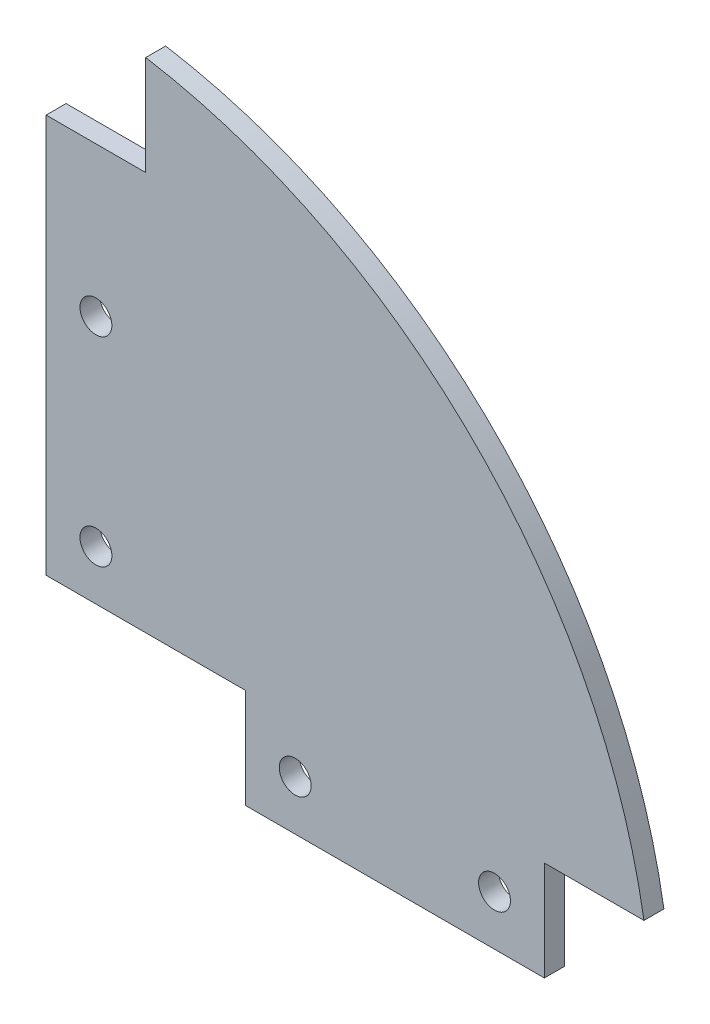
ISO-10303-21;
HEADER;
FILE_DESCRIPTION(('STEP AP214'),'2;1');
FILE_NAME('part.step','',(''),(''),'','','');
FILE_SCHEMA(('AUTOMOTIVE_DESIGN { 1 0 10303 214 1 1 1 1 }'));
ENDSEC;
DATA;
#1=APPLICATION_CONTEXT('core data for automotive mechanical design processes');
#2=APPLICATION_PROTOCOL_DEFINITION('international standard','automotive_design',2000,#1);
#3=PRODUCT_CONTEXT('',#1,'mechanical');
#4=PRODUCT('Part','Part','',(#3));
#5=PRODUCT_RELATED_PRODUCT_CATEGORY('part','',(#4));
#6=PRODUCT_DEFINITION_FORMATION('','',#4);
#7=PRODUCT_DEFINITION_CONTEXT('part definition',#1,'design');
#8=PRODUCT_DEFINITION('design','',#6,#7);
#9=PRODUCT_DEFINITION_SHAPE('','',#8);
#10=(LENGTH_UNIT() NAMED_UNIT(*) SI_UNIT(.MILLI.,.METRE.));
#11=(NAMED_UNIT(*) PLANE_ANGLE_UNIT() SI_UNIT($,.RADIAN.));
#12=(NAMED_UNIT(*) SI_UNIT($,.STERADIAN.) SOLID_ANGLE_UNIT());
#13=UNCERTAINTY_MEASURE_WITH_UNIT(LENGTH_MEASURE(1.E-05),#10,'distance_accuracy_value','');
#14=(GEOMETRIC_REPRESENTATION_CONTEXT(3) GLOBAL_UNCERTAINTY_ASSIGNED_CONTEXT((#13)) GLOBAL_UNIT_ASSIGNED_CONTEXT((#10,
#11,#12)) REPRESENTATION_CONTEXT('',''));
#15=CARTESIAN_POINT('',(0.,0.,0.));
#16=DIRECTION('',(0.,0.,1.));
#17=DIRECTION('',(1.,0.,0.));
#18=AXIS2_PLACEMENT_3D('',#15,#16,#17);
#19=CARTESIAN_POINT('',(0.,0.,2.));
#20=DIRECTION('',(0.,0.,1.));
#21=DIRECTION('',(1.,0.,0.));
#22=AXIS2_PLACEMENT_3D('',#19,#20,#21);
#23=PLANE('',#22);
#24=CARTESIAN_POINT('',(25.,4.99999999999995,2.));
#25=DIRECTION('',(0.,0.,1.));
#26=DIRECTION('',(1.,0.,0.));
#27=AXIS2_PLACEMENT_3D('',#24,#25,#26);
#28=CIRCLE('',#27,1.6);
#29=CARTESIAN_POINT('',(26.6,4.99999999999995,2.));
#30=VERTEX_POINT('',#29);
#31=EDGE_CURVE('E204',#30,#30,#28,.T.);
#32=ORIENTED_EDGE('',*,*,#31,.F.);
#33=EDGE_LOOP('',(#32));
#34=FACE_BOUND('',#33,.T.);
#35=CARTESIAN_POINT('',(5.00000000000001,34.9999999999999,2.));
#36=DIRECTION('',(0.,0.,1.));
#37=DIRECTION('',(1.,0.,0.));
#38=AXIS2_PLACEMENT_3D('',#35,#36,#37);
#39=CIRCLE('',#38,1.6);
#40=CARTESIAN_POINT('',(6.6,34.9999999999999,2.));
#41=VERTEX_POINT('',#40);
#42=EDGE_CURVE('E140',#41,#41,#39,.T.);
#43=ORIENTED_EDGE('',*,*,#42,.F.);
#44=EDGE_LOOP('',(#43));
#45=FACE_BOUND('',#44,.T.);
#46=DIRECTION('',(0.,-1.,0.));
#47=VECTOR('',#46,1.);
#48=CARTESIAN_POINT('',(20.,9.9999999999999,2.));
#49=LINE('',#48,#47);
#50=CARTESIAN_POINT('',(20.,9.9999999999999,2.));
#51=VERTEX_POINT('',#50);
#52=CARTESIAN_POINT('',(20.,0.,2.));
#53=VERTEX_POINT('',#52);
#54=EDGE_CURVE('E153',#51,#53,#49,.T.);
#55=ORIENTED_EDGE('',*,*,#54,.T.);
#56=DIRECTION('',(1.,0.,0.));
#57=VECTOR('',#56,1.);
#58=CARTESIAN_POINT('',(20.,0.,2.));
#59=LINE('',#58,#57);
#60=CARTESIAN_POINT('',(50.,0.,2.));
#61=VERTEX_POINT('',#60);
#62=EDGE_CURVE('E96',#53,#61,#59,.T.);
#63=ORIENTED_EDGE('',*,*,#62,.T.);
#64=DIRECTION('',(0.,1.,0.));
#65=VECTOR('',#64,1.);
#66=CARTESIAN_POINT('',(50.,0.,2.));
#67=LINE('',#66,#65);
#68=CARTESIAN_POINT('',(50.,10.,2.));
#69=VERTEX_POINT('',#68);
#70=EDGE_CURVE('E171',#61,#69,#67,.T.);
#71=ORIENTED_EDGE('',*,*,#70,.T.);
#72=DIRECTION('',(1.,0.,0.));
#73=VECTOR('',#72,1.);
#74=CARTESIAN_POINT('',(50.,10.,2.));
#75=LINE('',#74,#73);
#76=CARTESIAN_POINT('',(60.,10.,2.));
#77=VERTEX_POINT('',#76);
#78=EDGE_CURVE('E188',#69,#77,#75,.T.);
#79=ORIENTED_EDGE('',*,*,#78,.T.);
#80=CARTESIAN_POINT('',(0.,0.,2.));
#81=DIRECTION('',(0.,0.,1.));
#82=DIRECTION('',(1.,0.,0.));
#83=AXIS2_PLACEMENT_3D('',#80,#81,#82);
#84=CIRCLE('',#83,60.8276253029822);
#85=CARTESIAN_POINT('',(10.,60.,2.));
#86=VERTEX_POINT('',#85);
#87=EDGE_CURVE('E187',#77,#86,#84,.T.);
#88=ORIENTED_EDGE('',*,*,#87,.T.);
#89=DIRECTION('',(0.,-1.,0.));
#90=VECTOR('',#89,1.);
#91=CARTESIAN_POINT('',(10.,60.,2.));
#92=LINE('',#91,#90);
#93=CARTESIAN_POINT('',(10.,50.,2.));
#94=VERTEX_POINT('',#93);
#95=EDGE_CURVE('E118',#86,#94,#92,.T.);
#96=ORIENTED_EDGE('',*,*,#95,.T.);
#97=DIRECTION('',(-1.,0.,0.));
#98=VECTOR('',#97,1.);
#99=CARTESIAN_POINT('',(10.,50.,2.));
#100=LINE('',#99,#98);
#101=CARTESIAN_POINT('',(0.,50.,2.));
#102=VERTEX_POINT('',#101);
#103=EDGE_CURVE('E112',#94,#102,#100,.T.);
#104=ORIENTED_EDGE('',*,*,#103,.T.);
#105=DIRECTION('',(0.,-1.,0.));
#106=VECTOR('',#105,1.);
#107=CARTESIAN_POINT('',(0.,50.,2.));
#108=LINE('',#107,#106);
#109=CARTESIAN_POINT('',(0.,9.9999999999999,2.));
#110=VERTEX_POINT('',#109);
#111=EDGE_CURVE('E116',#102,#110,#108,.T.);
#112=ORIENTED_EDGE('',*,*,#111,.T.);
#113=DIRECTION('',(1.,0.,0.));
#114=VECTOR('',#113,1.);
#115=CARTESIAN_POINT('',(0.,9.9999999999999,2.));
#116=LINE('',#115,#114);
#117=EDGE_CURVE('E50',#110,#51,#116,.T.);
#118=ORIENTED_EDGE('',*,*,#117,.T.);
#119=EDGE_LOOP('',(#55,#63,#71,#79,#88,#96,#104,#112,#118));
#120=FACE_BOUND('',#119,.T.);
#121=CARTESIAN_POINT('',(5.00000000000001,14.9999999999999,2.));
#122=DIRECTION('',(0.,0.,1.));
#123=DIRECTION('',(1.,0.,0.));
#124=AXIS2_PLACEMENT_3D('',#121,#122,#123);
#125=CIRCLE('',#124,1.6);
#126=CARTESIAN_POINT('',(6.60000000000001,14.9999999999999,2.));
#127=VERTEX_POINT('',#126);
#128=EDGE_CURVE('E198',#127,#127,#125,.T.);
#129=ORIENTED_EDGE('',*,*,#128,.F.);
#130=EDGE_LOOP('',(#129));
#131=FACE_BOUND('',#130,.T.);
#132=CARTESIAN_POINT('',(45.,4.99999999999995,2.));
#133=DIRECTION('',(0.,0.,1.));
#134=DIRECTION('',(1.,0.,0.));
#135=AXIS2_PLACEMENT_3D('',#132,#133,#134);
#136=CIRCLE('',#135,1.6);
#137=CARTESIAN_POINT('',(46.6,4.99999999999995,2.));
#138=VERTEX_POINT('',#137);
#139=EDGE_CURVE('E210',#138,#138,#136,.T.);
#140=ORIENTED_EDGE('',*,*,#139,.F.);
#141=EDGE_LOOP('',(#140));
#142=FACE_BOUND('',#141,.T.);
#143=ADVANCED_FACE('F33',(#34,#45,#120,#131,#142),#23,.T.);
#144=CARTESIAN_POINT('',(0.,0.,0.));
#145=DIRECTION('',(0.,0.,1.));
#146=DIRECTION('',(1.,0.,0.));
#147=AXIS2_PLACEMENT_3D('',#144,#145,#146);
#148=PLANE('',#147);
#149=DIRECTION('',(0.,-1.,0.));
#150=VECTOR('',#149,1.);
#151=CARTESIAN_POINT('',(20.,9.9999999999999,0.));
#152=LINE('',#151,#150);
#153=CARTESIAN_POINT('',(20.,9.9999999999999,0.));
#154=VERTEX_POINT('',#153);
#155=CARTESIAN_POINT('',(20.,0.,0.));
#156=VERTEX_POINT('',#155);
#157=EDGE_CURVE('E136',#154,#156,#152,.T.);
#158=ORIENTED_EDGE('',*,*,#157,.F.);
#159=DIRECTION('',(1.,0.,0.));
#160=VECTOR('',#159,1.);
#161=CARTESIAN_POINT('',(0.,9.9999999999999,0.));
#162=LINE('',#161,#160);
#163=CARTESIAN_POINT('',(0.,9.9999999999999,0.));
#164=VERTEX_POINT('',#163);
#165=EDGE_CURVE('E88',#164,#154,#162,.T.);
#166=ORIENTED_EDGE('',*,*,#165,.F.);
#167=DIRECTION('',(0.,-1.,0.));
#168=VECTOR('',#167,1.);
#169=CARTESIAN_POINT('',(0.,50.,0.));
#170=LINE('',#169,#168);
#171=CARTESIAN_POINT('',(0.,50.,0.));
#172=VERTEX_POINT('',#171);
#173=EDGE_CURVE('E82',#172,#164,#170,.T.);
#174=ORIENTED_EDGE('',*,*,#173,.F.);
#175=DIRECTION('',(-1.,0.,0.));
#176=VECTOR('',#175,1.);
#177=CARTESIAN_POINT('',(10.,50.,0.));
#178=LINE('',#177,#176);
#179=CARTESIAN_POINT('',(10.,50.,0.));
#180=VERTEX_POINT('',#179);
#181=EDGE_CURVE('E126',#180,#172,#178,.T.);
#182=ORIENTED_EDGE('',*,*,#181,.F.);
#183=DIRECTION('',(0.,-1.,0.));
#184=VECTOR('',#183,1.);
#185=CARTESIAN_POINT('',(10.,60.,0.));
#186=LINE('',#185,#184);
#187=CARTESIAN_POINT('',(10.,60.,0.));
#188=VERTEX_POINT('',#187);
#189=EDGE_CURVE('E148',#188,#180,#186,.T.);
#190=ORIENTED_EDGE('',*,*,#189,.F.);
#191=CARTESIAN_POINT('',(0.,0.,0.));
#192=DIRECTION('',(0.,0.,1.));
#193=DIRECTION('',(1.,0.,0.));
#194=AXIS2_PLACEMENT_3D('',#191,#192,#193);
#195=CIRCLE('',#194,60.8276253029822);
#196=CARTESIAN_POINT('',(60.,10.,0.));
#197=VERTEX_POINT('',#196);
#198=EDGE_CURVE('E146',#197,#188,#195,.T.);
#199=ORIENTED_EDGE('',*,*,#198,.F.);
#200=DIRECTION('',(1.,0.,0.));
#201=VECTOR('',#200,1.);
#202=CARTESIAN_POINT('',(50.,10.,0.));
#203=LINE('',#202,#201);
#204=CARTESIAN_POINT('',(50.,10.,0.));
#205=VERTEX_POINT('',#204);
#206=EDGE_CURVE('E144',#205,#197,#203,.T.);
#207=ORIENTED_EDGE('',*,*,#206,.F.);
#208=DIRECTION('',(0.,1.,0.));
#209=VECTOR('',#208,1.);
#210=CARTESIAN_POINT('',(50.,0.,0.));
#211=LINE('',#210,#209);
#212=CARTESIAN_POINT('',(50.,0.,0.));
#213=VERTEX_POINT('',#212);
#214=EDGE_CURVE('E142',#213,#205,#211,.T.);
#215=ORIENTED_EDGE('',*,*,#214,.F.);
#216=DIRECTION('',(1.,0.,0.));
#217=VECTOR('',#216,1.);
#218=CARTESIAN_POINT('',(20.,0.,0.));
#219=LINE('',#218,#217);
#220=EDGE_CURVE('E139',#156,#213,#219,.T.);
#221=ORIENTED_EDGE('',*,*,#220,.F.);
#222=EDGE_LOOP('',(#158,#166,#174,#182,#190,#199,#207,#215,#221));
#223=FACE_BOUND('',#222,.T.);
#224=CARTESIAN_POINT('',(5.00000000000001,34.9999999999999,0.));
#225=DIRECTION('',(0.,0.,1.));
#226=DIRECTION('',(1.,0.,0.));
#227=AXIS2_PLACEMENT_3D('',#224,#225,#226);
#228=CIRCLE('',#227,1.6);
#229=CARTESIAN_POINT('',(6.6,34.9999999999999,0.));
#230=VERTEX_POINT('',#229);
#231=EDGE_CURVE('E195',#230,#230,#228,.T.);
#232=ORIENTED_EDGE('',*,*,#231,.T.);
#233=EDGE_LOOP('',(#232));
#234=FACE_BOUND('',#233,.T.);
#235=CARTESIAN_POINT('',(5.00000000000001,14.9999999999999,0.));
#236=DIRECTION('',(0.,0.,1.));
#237=DIRECTION('',(1.,0.,0.));
#238=AXIS2_PLACEMENT_3D('',#235,#236,#237);
#239=CIRCLE('',#238,1.6);
#240=CARTESIAN_POINT('',(6.60000000000001,14.9999999999999,0.));
#241=VERTEX_POINT('',#240);
#242=EDGE_CURVE('E201',#241,#241,#239,.T.);
#243=ORIENTED_EDGE('',*,*,#242,.T.);
#244=EDGE_LOOP('',(#243));
#245=FACE_BOUND('',#244,.T.);
#246=CARTESIAN_POINT('',(25.,4.99999999999995,0.));
#247=DIRECTION('',(0.,0.,1.));
#248=DIRECTION('',(1.,0.,0.));
#249=AXIS2_PLACEMENT_3D('',#246,#247,#248);
#250=CIRCLE('',#249,1.6);
#251=CARTESIAN_POINT('',(26.6,4.99999999999995,0.));
#252=VERTEX_POINT('',#251);
#253=EDGE_CURVE('E207',#252,#252,#250,.T.);
#254=ORIENTED_EDGE('',*,*,#253,.T.);
#255=EDGE_LOOP('',(#254));
#256=FACE_BOUND('',#255,.T.);
#257=CARTESIAN_POINT('',(45.,4.99999999999995,0.));
#258=DIRECTION('',(0.,0.,1.));
#259=DIRECTION('',(1.,0.,0.));
#260=AXIS2_PLACEMENT_3D('',#257,#258,#259);
#261=CIRCLE('',#260,1.6);
#262=CARTESIAN_POINT('',(46.6,4.99999999999995,0.));
#263=VERTEX_POINT('',#262);
#264=EDGE_CURVE('E213',#263,#263,#261,.T.);
#265=ORIENTED_EDGE('',*,*,#264,.T.);
#266=EDGE_LOOP('',(#265));
#267=FACE_BOUND('',#266,.T.);
#268=ADVANCED_FACE('F175',(#223,#234,#245,#256,#267),#148,.F.);
#269=CARTESIAN_POINT('',(20.,9.9999999999999,2.));
#270=DIRECTION('',(1.,0.,0.));
#271=DIRECTION('',(0.,1.,0.));
#272=AXIS2_PLACEMENT_3D('',#269,#270,#271);
#273=PLANE('',#272);
#274=ORIENTED_EDGE('',*,*,#157,.T.);
#275=DIRECTION('',(0.,0.,-1.));
#276=VECTOR('',#275,1.);
#277=CARTESIAN_POINT('',(20.,0.,2.));
#278=LINE('',#277,#276);
#279=EDGE_CURVE('E11',#53,#156,#278,.T.);
#280=ORIENTED_EDGE('',*,*,#279,.F.);
#281=ORIENTED_EDGE('',*,*,#54,.F.);
#282=DIRECTION('',(0.,0.,-1.));
#283=VECTOR('',#282,1.);
#284=CARTESIAN_POINT('',(20.,9.9999999999999,2.));
#285=LINE('',#284,#283);
#286=EDGE_CURVE('E132',#51,#154,#285,.T.);
#287=ORIENTED_EDGE('',*,*,#286,.T.);
#288=EDGE_LOOP('',(#274,#280,#281,#287));
#289=FACE_BOUND('',#288,.T.);
#290=ADVANCED_FACE('F35',(#289),#273,.F.);
#291=CARTESIAN_POINT('',(20.,0.,2.));
#292=DIRECTION('',(0.,1.,0.));
#293=DIRECTION('',(-1.,0.,0.));
#294=AXIS2_PLACEMENT_3D('',#291,#292,#293);
#295=PLANE('',#294);
#296=ORIENTED_EDGE('',*,*,#220,.T.);
#297=DIRECTION('',(0.,0.,-1.));
#298=VECTOR('',#297,1.);
#299=CARTESIAN_POINT('',(50.,0.,2.));
#300=LINE('',#299,#298);
#301=EDGE_CURVE('E42',#61,#213,#300,.T.);
#302=ORIENTED_EDGE('',*,*,#301,.F.);
#303=ORIENTED_EDGE('',*,*,#62,.F.);
#304=ORIENTED_EDGE('',*,*,#279,.T.);
#305=EDGE_LOOP('',(#296,#302,#303,#304));
#306=FACE_BOUND('',#305,.T.);
#307=ADVANCED_FACE('F251',(#306),#295,.F.);
#308=CARTESIAN_POINT('',(50.,0.,2.));
#309=DIRECTION('',(-1.,0.,0.));
#310=DIRECTION('',(0.,0.,1.));
#311=AXIS2_PLACEMENT_3D('',#308,#309,#310);
#312=PLANE('',#311);
#313=ORIENTED_EDGE('',*,*,#214,.T.);
#314=DIRECTION('',(0.,0.,-1.));
#315=VECTOR('',#314,1.);
#316=CARTESIAN_POINT('',(50.,10.,2.));
#317=LINE('',#316,#315);
#318=EDGE_CURVE('E163',#69,#205,#317,.T.);
#319=ORIENTED_EDGE('',*,*,#318,.F.);
#320=ORIENTED_EDGE('',*,*,#70,.F.);
#321=ORIENTED_EDGE('',*,*,#301,.T.);
#322=EDGE_LOOP('',(#313,#319,#320,#321));
#323=FACE_BOUND('',#322,.T.);
#324=ADVANCED_FACE('F169',(#323),#312,.F.);
#325=CARTESIAN_POINT('',(50.,10.,2.));
#326=DIRECTION('',(0.,1.,0.));
#327=DIRECTION('',(0.,0.,1.));
#328=AXIS2_PLACEMENT_3D('',#325,#326,#327);
#329=PLANE('',#328);
#330=ORIENTED_EDGE('',*,*,#206,.T.);
#331=DIRECTION('',(0.,0.,-1.));
#332=VECTOR('',#331,1.);
#333=CARTESIAN_POINT('',(60.,10.,2.));
#334=LINE('',#333,#332);
#335=EDGE_CURVE('E160',#77,#197,#334,.T.);
#336=ORIENTED_EDGE('',*,*,#335,.F.);
#337=ORIENTED_EDGE('',*,*,#78,.F.);
#338=ORIENTED_EDGE('',*,*,#318,.T.);
#339=EDGE_LOOP('',(#330,#336,#337,#338));
#340=FACE_BOUND('',#339,.T.);
#341=ADVANCED_FACE('F181',(#340),#329,.F.);
#342=CARTESIAN_POINT('',(0.,0.,2.));
#343=DIRECTION('',(0.,0.,-1.));
#344=DIRECTION('',(-1.,0.,0.));
#345=AXIS2_PLACEMENT_3D('',#342,#343,#344);
#346=CYLINDRICAL_SURFACE('',#345,60.8276253029822);
#347=ORIENTED_EDGE('',*,*,#198,.T.);
#348=DIRECTION('',(0.,0.,-1.));
#349=VECTOR('',#348,1.);
#350=CARTESIAN_POINT('',(10.,60.,2.));
#351=LINE('',#350,#349);
#352=EDGE_CURVE('E157',#86,#188,#351,.T.);
#353=ORIENTED_EDGE('',*,*,#352,.F.);
#354=ORIENTED_EDGE('',*,*,#87,.F.);
#355=ORIENTED_EDGE('',*,*,#335,.T.);
#356=EDGE_LOOP('',(#347,#353,#354,#355));
#357=FACE_BOUND('',#356,.T.);
#358=ADVANCED_FACE('F185',(#357),#346,.T.);
#359=CARTESIAN_POINT('',(10.,60.,2.));
#360=DIRECTION('',(1.,0.,0.));
#361=DIRECTION('',(0.,1.,0.));
#362=AXIS2_PLACEMENT_3D('',#359,#360,#361);
#363=PLANE('',#362);
#364=ORIENTED_EDGE('',*,*,#189,.T.);
#365=DIRECTION('',(0.,0.,-1.));
#366=VECTOR('',#365,1.);
#367=CARTESIAN_POINT('',(10.,50.,2.));
#368=LINE('',#367,#366);
#369=EDGE_CURVE('E127',#94,#180,#368,.T.);
#370=ORIENTED_EDGE('',*,*,#369,.F.);
#371=ORIENTED_EDGE('',*,*,#95,.F.);
#372=ORIENTED_EDGE('',*,*,#352,.T.);
#373=EDGE_LOOP('',(#364,#370,#371,#372));
#374=FACE_BOUND('',#373,.T.);
#375=ADVANCED_FACE('F242',(#374),#363,.F.);
#376=CARTESIAN_POINT('',(10.,50.,2.));
#377=DIRECTION('',(0.,-1.,0.));
#378=DIRECTION('',(0.,0.,-1.));
#379=AXIS2_PLACEMENT_3D('',#376,#377,#378);
#380=PLANE('',#379);
#381=ORIENTED_EDGE('',*,*,#181,.T.);
#382=DIRECTION('',(0.,0.,-1.));
#383=VECTOR('',#382,1.);
#384=CARTESIAN_POINT('',(0.,50.,2.));
#385=LINE('',#384,#383);
#386=EDGE_CURVE('E123',#102,#172,#385,.T.);
#387=ORIENTED_EDGE('',*,*,#386,.F.);
#388=ORIENTED_EDGE('',*,*,#103,.F.);
#389=ORIENTED_EDGE('',*,*,#369,.T.);
#390=EDGE_LOOP('',(#381,#387,#388,#389));
#391=FACE_BOUND('',#390,.T.);
#392=ADVANCED_FACE('F124',(#391),#380,.F.);
#393=CARTESIAN_POINT('',(0.,50.,2.));
#394=DIRECTION('',(1.,0.,0.));
#395=DIRECTION('',(0.,1.,0.));
#396=AXIS2_PLACEMENT_3D('',#393,#394,#395);
#397=PLANE('',#396);
#398=ORIENTED_EDGE('',*,*,#173,.T.);
#399=DIRECTION('',(0.,0.,-1.));
#400=VECTOR('',#399,1.);
#401=CARTESIAN_POINT('',(0.,9.9999999999999,2.));
#402=LINE('',#401,#400);
#403=EDGE_CURVE('E128',#110,#164,#402,.T.);
#404=ORIENTED_EDGE('',*,*,#403,.F.);
#405=ORIENTED_EDGE('',*,*,#111,.F.);
#406=ORIENTED_EDGE('',*,*,#386,.T.);
#407=EDGE_LOOP('',(#398,#404,#405,#406));
#408=FACE_BOUND('',#407,.T.);
#409=ADVANCED_FACE('F130',(#408),#397,.F.);
#410=CARTESIAN_POINT('',(0.,9.9999999999999,2.));
#411=DIRECTION('',(0.,1.,0.));
#412=DIRECTION('',(-1.,0.,0.));
#413=AXIS2_PLACEMENT_3D('',#410,#411,#412);
#414=PLANE('',#413);
#415=ORIENTED_EDGE('',*,*,#165,.T.);
#416=ORIENTED_EDGE('',*,*,#286,.F.);
#417=ORIENTED_EDGE('',*,*,#117,.F.);
#418=ORIENTED_EDGE('',*,*,#403,.T.);
#419=EDGE_LOOP('',(#415,#416,#417,#418));
#420=FACE_BOUND('',#419,.T.);
#421=ADVANCED_FACE('F235',(#420),#414,.F.);
#422=CARTESIAN_POINT('',(5.00000000000001,34.9999999999999,2.));
#423=DIRECTION('',(0.,0.,-1.));
#424=DIRECTION('',(-1.,0.,0.));
#425=AXIS2_PLACEMENT_3D('',#422,#423,#424);
#426=CYLINDRICAL_SURFACE('',#425,1.6);
#427=ORIENTED_EDGE('',*,*,#42,.T.);
#428=EDGE_LOOP('',(#427));
#429=FACE_BOUND('',#428,.T.);
#430=ORIENTED_EDGE('',*,*,#231,.F.);
#431=EDGE_LOOP('',(#430));
#432=FACE_BOUND('',#431,.T.);
#433=ADVANCED_FACE('F232',(#429,#432),#426,.F.);
#434=CARTESIAN_POINT('',(5.00000000000001,14.9999999999999,2.));
#435=DIRECTION('',(0.,0.,-1.));
#436=DIRECTION('',(-1.,0.,0.));
#437=AXIS2_PLACEMENT_3D('',#434,#435,#436);
#438=CYLINDRICAL_SURFACE('',#437,1.6);
#439=ORIENTED_EDGE('',*,*,#128,.T.);
#440=EDGE_LOOP('',(#439));
#441=FACE_BOUND('',#440,.T.);
#442=ORIENTED_EDGE('',*,*,#242,.F.);
#443=EDGE_LOOP('',(#442));
#444=FACE_BOUND('',#443,.T.);
#445=ADVANCED_FACE('F320',(#441,#444),#438,.F.);
#446=CARTESIAN_POINT('',(25.,4.99999999999995,2.));
#447=DIRECTION('',(0.,0.,-1.));
#448=DIRECTION('',(-1.,0.,0.));
#449=AXIS2_PLACEMENT_3D('',#446,#447,#448);
#450=CYLINDRICAL_SURFACE('',#449,1.6);
#451=ORIENTED_EDGE('',*,*,#31,.T.);
#452=EDGE_LOOP('',(#451));
#453=FACE_BOUND('',#452,.T.);
#454=ORIENTED_EDGE('',*,*,#253,.F.);
#455=EDGE_LOOP('',(#454));
#456=FACE_BOUND('',#455,.T.);
#457=ADVANCED_FACE('F328',(#453,#456),#450,.F.);
#458=CARTESIAN_POINT('',(45.,4.99999999999995,2.));
#459=DIRECTION('',(0.,0.,-1.));
#460=DIRECTION('',(-1.,0.,0.));
#461=AXIS2_PLACEMENT_3D('',#458,#459,#460);
#462=CYLINDRICAL_SURFACE('',#461,1.6);
#463=ORIENTED_EDGE('',*,*,#139,.T.);
#464=EDGE_LOOP('',(#463));
#465=FACE_BOUND('',#464,.T.);
#466=ORIENTED_EDGE('',*,*,#264,.F.);
#467=EDGE_LOOP('',(#466));
#468=FACE_BOUND('',#467,.T.);
#469=ADVANCED_FACE('F219',(#465,#468),#462,.F.);
#470=CLOSED_SHELL('',(#143,#268,#290,#307,#324,#341,#358,#375,#392,#409,#421,#433,#445,#457,#469));
#471=MANIFOLD_SOLID_BREP('B2',#470);
#472=ADVANCED_BREP_SHAPE_REPRESENTATION('',(#18,#471),#14);
#473=SHAPE_DEFINITION_REPRESENTATION(#9,#472);
ENDSEC;
END-ISO-10303-21;
